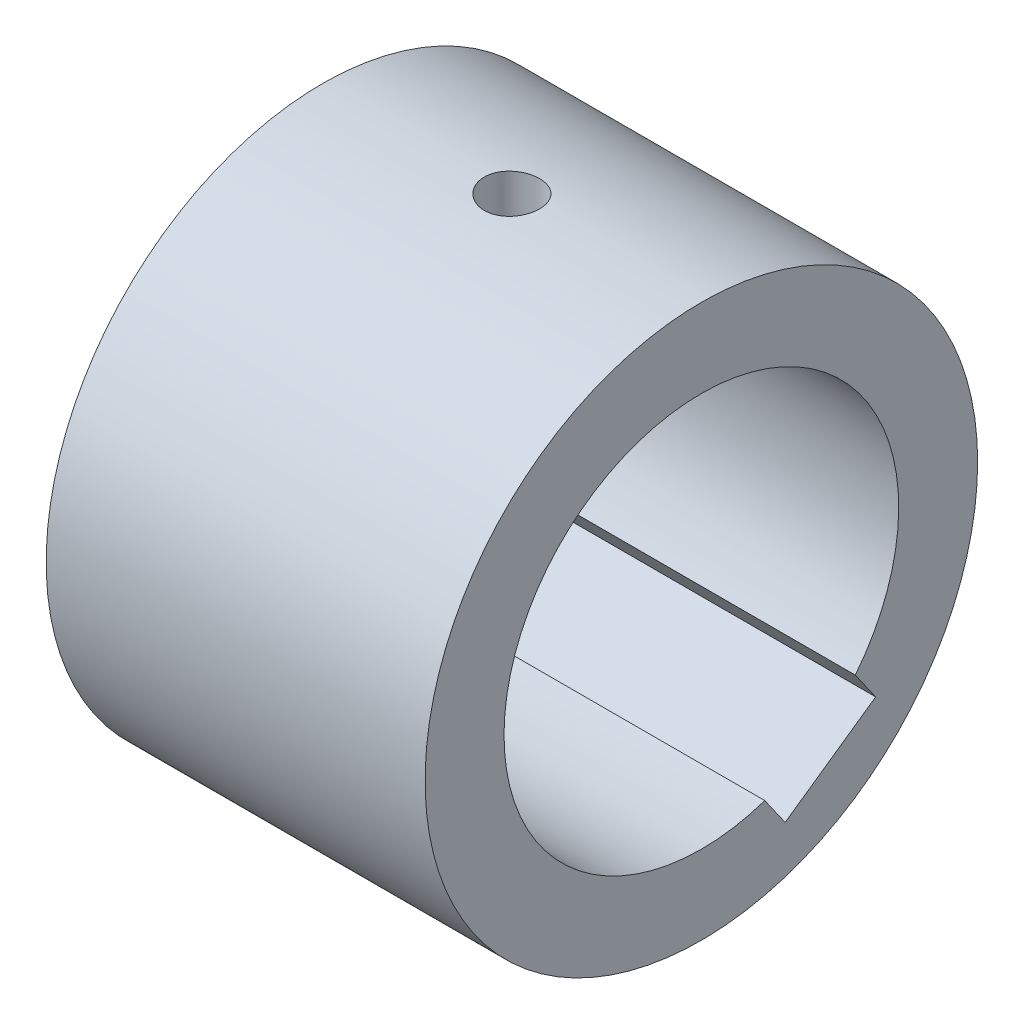
ISO-10303-21;
HEADER;
FILE_DESCRIPTION(('STEP AP214'),'2;1');
FILE_NAME('part.step','',(''),(''),'','','');
FILE_SCHEMA(('AUTOMOTIVE_DESIGN { 1 0 10303 214 1 1 1 1 }'));
ENDSEC;
DATA;
#1=APPLICATION_CONTEXT('core data for automotive mechanical design processes');
#2=APPLICATION_PROTOCOL_DEFINITION('international standard','automotive_design',2000,#1);
#3=PRODUCT_CONTEXT('',#1,'mechanical');
#4=PRODUCT('Part','Part','',(#3));
#5=PRODUCT_RELATED_PRODUCT_CATEGORY('part','',(#4));
#6=PRODUCT_DEFINITION_FORMATION('','',#4);
#7=PRODUCT_DEFINITION_CONTEXT('part definition',#1,'design');
#8=PRODUCT_DEFINITION('design','',#6,#7);
#9=PRODUCT_DEFINITION_SHAPE('','',#8);
#10=(LENGTH_UNIT() NAMED_UNIT(*) SI_UNIT(.MILLI.,.METRE.));
#11=(NAMED_UNIT(*) PLANE_ANGLE_UNIT() SI_UNIT($,.RADIAN.));
#12=(NAMED_UNIT(*) SI_UNIT($,.STERADIAN.) SOLID_ANGLE_UNIT());
#13=UNCERTAINTY_MEASURE_WITH_UNIT(LENGTH_MEASURE(1.E-05),#10,'distance_accuracy_value','');
#14=(GEOMETRIC_REPRESENTATION_CONTEXT(3) GLOBAL_UNCERTAINTY_ASSIGNED_CONTEXT((#13)) GLOBAL_UNIT_ASSIGNED_CONTEXT((#10,
#11,#12)) REPRESENTATION_CONTEXT('',''));
#15=CARTESIAN_POINT('',(0.,0.,0.));
#16=DIRECTION('',(0.,0.,1.));
#17=DIRECTION('',(1.,0.,0.));
#18=AXIS2_PLACEMENT_3D('',#15,#16,#17);
#19=CARTESIAN_POINT('',(24.,0.,0.));
#20=DIRECTION('',(1.,0.,0.));
#21=DIRECTION('',(0.,0.,-1.));
#22=AXIS2_PLACEMENT_3D('',#19,#20,#21);
#23=PLANE('',#22);
#24=DIRECTION('',(0.,0.819152044288985,0.573576436351056));
#25=VECTOR('',#24,1.);
#26=CARTESIAN_POINT('',(24.,-7.91344621185209,-14.0864768120863));
#27=LINE('',#26,#25);
#28=CARTESIAN_POINT('',(24.,-19.3307982077787,-22.080992746028));
#29=VERTEX_POINT('',#28);
#30=CARTESIAN_POINT('',(24.,-15.6446140084783,-19.4998987824482));
#31=VERTEX_POINT('',#30);
#32=EDGE_CURVE('E118',#29,#31,#27,.T.);
#33=ORIENTED_EDGE('',*,*,#32,.F.);
#34=DIRECTION('',(0.,0.573576436351056,-0.819152044288985));
#35=VECTOR('',#34,1.);
#36=CARTESIAN_POINT('',(24.,-19.3307982077787,-22.080992746028));
#37=LINE('',#36,#35);
#38=CARTESIAN_POINT('',(24.,-27.3608683166935,-10.6128641259822));
#39=VERTEX_POINT('',#38);
#40=EDGE_CURVE('E114',#39,#29,#37,.T.);
#41=ORIENTED_EDGE('',*,*,#40,.F.);
#42=DIRECTION('',(0.,-0.819152044288985,-0.573576436351056));
#43=VECTOR('',#42,1.);
#44=CARTESIAN_POINT('',(24.,-27.3608683166935,-10.6128641259822));
#45=LINE('',#44,#43);
#46=CARTESIAN_POINT('',(24.,-23.674684117393,-8.03177016240245));
#47=VERTEX_POINT('',#46);
#48=EDGE_CURVE('E97',#47,#39,#45,.T.);
#49=ORIENTED_EDGE('',*,*,#48,.F.);
#50=CARTESIAN_POINT('',(24.,0.,0.));
#51=DIRECTION('',(1.,0.,0.));
#52=DIRECTION('',(0.,0.,-1.));
#53=AXIS2_PLACEMENT_3D('',#50,#51,#52);
#54=CIRCLE('',#53,25.);
#55=EDGE_CURVE('E124',#31,#47,#54,.T.);
#56=ORIENTED_EDGE('',*,*,#55,.F.);
#57=EDGE_LOOP('',(#33,#41,#49,#56));
#58=FACE_BOUND('',#57,.T.);
#59=CARTESIAN_POINT('',(24.,0.,0.));
#60=DIRECTION('',(1.,0.,0.));
#61=DIRECTION('',(0.,0.,-1.));
#62=AXIS2_PLACEMENT_3D('',#59,#60,#61);
#63=CIRCLE('',#62,35.);
#64=CARTESIAN_POINT('',(24.,0.,-35.));
#65=VERTEX_POINT('',#64);
#66=EDGE_CURVE('E129',#65,#65,#63,.T.);
#67=ORIENTED_EDGE('',*,*,#66,.T.);
#68=EDGE_LOOP('',(#67));
#69=FACE_BOUND('',#68,.T.);
#70=ADVANCED_FACE('F48',(#58,#69),#23,.T.);
#71=CARTESIAN_POINT('',(-24.,0.,0.));
#72=DIRECTION('',(1.,0.,0.));
#73=DIRECTION('',(0.,0.,-1.));
#74=AXIS2_PLACEMENT_3D('',#71,#72,#73);
#75=PLANE('',#74);
#76=CARTESIAN_POINT('',(-24.,0.,0.));
#77=DIRECTION('',(1.,0.,0.));
#78=DIRECTION('',(0.,0.,-1.));
#79=AXIS2_PLACEMENT_3D('',#76,#77,#78);
#80=CIRCLE('',#79,35.);
#81=CARTESIAN_POINT('',(-24.,0.,-35.));
#82=VERTEX_POINT('',#81);
#83=EDGE_CURVE('E127',#82,#82,#80,.T.);
#84=ORIENTED_EDGE('',*,*,#83,.F.);
#85=EDGE_LOOP('',(#84));
#86=FACE_BOUND('',#85,.T.);
#87=DIRECTION('',(0.,0.573576436351056,-0.819152044288985));
#88=VECTOR('',#87,1.);
#89=CARTESIAN_POINT('',(-24.,-19.3307982077787,-22.080992746028));
#90=LINE('',#89,#88);
#91=CARTESIAN_POINT('',(-24.,-27.3608683166935,-10.6128641259822));
#92=VERTEX_POINT('',#91);
#93=CARTESIAN_POINT('',(-24.,-19.3307982077787,-22.080992746028));
#94=VERTEX_POINT('',#93);
#95=EDGE_CURVE('E102',#92,#94,#90,.T.);
#96=ORIENTED_EDGE('',*,*,#95,.T.);
#97=DIRECTION('',(0.,0.819152044288985,0.573576436351056));
#98=VECTOR('',#97,1.);
#99=CARTESIAN_POINT('',(-24.,-7.91344621185209,-14.0864768120863));
#100=LINE('',#99,#98);
#101=CARTESIAN_POINT('',(-24.,-15.6446140084783,-19.4998987824482));
#102=VERTEX_POINT('',#101);
#103=EDGE_CURVE('E112',#94,#102,#100,.T.);
#104=ORIENTED_EDGE('',*,*,#103,.T.);
#105=CARTESIAN_POINT('',(-24.,0.,0.));
#106=DIRECTION('',(1.,0.,0.));
#107=DIRECTION('',(0.,0.,-1.));
#108=AXIS2_PLACEMENT_3D('',#105,#106,#107);
#109=CIRCLE('',#108,25.);
#110=CARTESIAN_POINT('',(-24.,-23.674684117393,-8.03177016240245));
#111=VERTEX_POINT('',#110);
#112=EDGE_CURVE('E111',#102,#111,#109,.T.);
#113=ORIENTED_EDGE('',*,*,#112,.T.);
#114=DIRECTION('',(0.,-0.819152044288985,-0.573576436351056));
#115=VECTOR('',#114,1.);
#116=CARTESIAN_POINT('',(-24.,-27.3608683166935,-10.6128641259822));
#117=LINE('',#116,#115);
#118=EDGE_CURVE('E70',#111,#92,#117,.T.);
#119=ORIENTED_EDGE('',*,*,#118,.T.);
#120=EDGE_LOOP('',(#96,#104,#113,#119));
#121=FACE_BOUND('',#120,.T.);
#122=ADVANCED_FACE('F109',(#86,#121),#75,.F.);
#123=CARTESIAN_POINT('',(24.,0.,0.));
#124=DIRECTION('',(-1.,0.,0.));
#125=DIRECTION('',(0.,0.,1.));
#126=AXIS2_PLACEMENT_3D('',#123,#124,#125);
#127=CYLINDRICAL_SURFACE('',#126,35.);
#128=CARTESIAN_POINT('',(0.,34.8245602987317,3.49999999999988));
#129=CARTESIAN_POINT('',(-0.196068474615196,34.8245625976248,3.4999915068767));
#130=CARTESIAN_POINT('',(-0.392266589464245,34.8262339934706,3.48346900643453));
#131=CARTESIAN_POINT('',(-0.779223152048499,34.8327380631546,3.41780710166835));
#132=CARTESIAN_POINT('',(-0.969975363135411,34.8375742207731,3.36863175210201));
#133=CARTESIAN_POINT('',(-1.34038036725521,34.8498546570279,3.23911040624265));
#134=CARTESIAN_POINT('',(-1.52003981286804,34.8572973542366,3.15878330702893));
#135=CARTESIAN_POINT('',(-1.86328727302312,34.8739503199148,2.96927493586832));
#136=CARTESIAN_POINT('',(-2.02687847069355,34.883160237225,2.86009939469051));
#137=CARTESIAN_POINT('',(-2.33397942280071,34.9023474348731,2.61556666699545));
#138=CARTESIAN_POINT('',(-2.4774225332631,34.9123271001915,2.48012596337881));
#139=CARTESIAN_POINT('',(-2.73958163151263,34.931907683243,2.18708600361832));
#140=CARTESIAN_POINT('',(-2.85829648792213,34.9415085836306,2.02948573417286));
#141=CARTESIAN_POINT('',(-3.06785939952499,34.9592734104481,1.69619226577834));
#142=CARTESIAN_POINT('',(-3.15864849577781,34.9674342813132,1.52046181885337));
#143=CARTESIAN_POINT('',(-3.3094055160204,34.9813735906515,1.15615494500616));
#144=CARTESIAN_POINT('',(-3.36937419129314,34.9871520871971,0.967578831338643));
#145=CARTESIAN_POINT('',(-3.45659268273637,34.995658829986,0.583606739600202));
#146=CARTESIAN_POINT('',(-3.48395191462481,34.9983972744986,0.388235844610414));
#147=CARTESIAN_POINT('',(-3.50551344196801,35.0005500459542,-0.00434259241142233));
#148=CARTESIAN_POINT('',(-3.49971659711196,34.9999644590845,-0.201550086690736));
#149=CARTESIAN_POINT('',(-3.45521934572445,34.9955434958915,-0.591460954226082));
#150=CARTESIAN_POINT('',(-3.41663659552638,34.99171974031,-0.784177904772548));
#151=CARTESIAN_POINT('',(-3.30784604868683,34.9812655242726,-1.16038712826599));
#152=CARTESIAN_POINT('',(-3.2376378412435,34.9746350273584,-1.34387928135217));
#153=CARTESIAN_POINT('',(-3.06746032860946,34.959292811937,-1.69680110137867));
#154=CARTESIAN_POINT('',(-2.96743895864445,34.9505774578015,-1.8662054984359));
#155=CARTESIAN_POINT('',(-2.74051216832271,34.9320434581793,-2.1858672961098));
#156=CARTESIAN_POINT('',(-2.61360595949186,34.9222247803384,-2.33612413496302));
#157=CARTESIAN_POINT('',(-2.33585019670224,34.9025352713748,-2.61391470137953));
#158=CARTESIAN_POINT('',(-2.18489829340448,34.892664400056,-2.74134611166633));
#159=CARTESIAN_POINT('',(-1.86369097176228,34.8740258974878,-2.96907637375283));
#160=CARTESIAN_POINT('',(-1.6934355254175,34.8652582678387,-3.06937518619524));
#161=CARTESIAN_POINT('',(-1.33837541180073,34.8498181329952,-3.23999264600643));
#162=CARTESIAN_POINT('',(-1.15356768651989,34.8431460696394,-3.31030497200548));
#163=CARTESIAN_POINT('',(-0.77468788384859,34.8326615654828,-3.41887257473168));
#164=CARTESIAN_POINT('',(-0.580616088893944,34.8288490375619,-3.45712882810074));
#165=CARTESIAN_POINT('',(-0.189615371646723,34.8245303184596,-3.50036671387198));
#166=CARTESIAN_POINT('',(0.00729757092691552,34.8240099041661,-3.50549148826536));
#167=CARTESIAN_POINT('',(0.39917943038002,34.826296797417,-3.48269686404989));
#168=CARTESIAN_POINT('',(0.594148373491285,34.8291040599971,-3.45477791193426));
#169=CARTESIAN_POINT('',(0.976190537974195,34.8377170547841,-3.36680811077644));
#170=CARTESIAN_POINT('',(1.16327949883131,34.8435164700471,-3.3068249451613));
#171=CARTESIAN_POINT('',(1.52474018105607,34.8574551863578,-3.15649851886591));
#172=CARTESIAN_POINT('',(1.69911161100514,34.8655945410034,-3.06615456274268));
#173=CARTESIAN_POINT('',(2.03083990910072,34.88333045245,-2.85731250498138));
#174=CARTESIAN_POINT('',(2.18813679688189,34.8929318785135,-2.73871954944254));
#175=CARTESIAN_POINT('',(2.48064268645923,34.9124941418815,-2.47688186707923));
#176=CARTESIAN_POINT('',(2.61585114119027,34.9224549880803,-2.33363652986859));
#177=CARTESIAN_POINT('',(2.86083571689332,34.9416566747256,-2.02593931479278));
#178=CARTESIAN_POINT('',(2.97051845855177,34.9508947919416,-1.8614128958932));
#179=CARTESIAN_POINT('',(3.16069553977244,34.9675704737321,-1.51619201096008));
#180=CARTESIAN_POINT('',(3.24119027927486,34.9750080629773,-1.33549776650381));
#181=CARTESIAN_POINT('',(3.37054818679367,34.9872323644902,-0.963396442514975));
#182=CARTESIAN_POINT('',(3.41946775563825,34.9920238011977,-0.77200913177498));
#183=CARTESIAN_POINT('',(3.48447074352945,34.9984353114778,-0.383686848942998));
#184=CARTESIAN_POINT('',(3.50055508541913,35.0000554741798,-0.186752032922882));
#185=CARTESIAN_POINT('',(3.4994180674602,34.9999418409643,0.206157784264988));
#186=CARTESIAN_POINT('',(3.48234167107171,34.998222643183,0.402133225285718));
#187=CARTESIAN_POINT('',(3.41567189020057,34.9916522752161,0.788416609247154));
#188=CARTESIAN_POINT('',(3.36607848019455,34.9868011025722,0.978724547739183));
#189=CARTESIAN_POINT('',(3.23582259912479,34.974510333487,1.34826968068696));
#190=CARTESIAN_POINT('',(3.15516436573066,34.9670710901076,1.52750838127113));
#191=CARTESIAN_POINT('',(2.96508390879036,34.9504334345765,1.86992610054176));
#192=CARTESIAN_POINT('',(2.8556618535503,34.9412350327182,2.03310521319019));
#193=CARTESIAN_POINT('',(2.61061633341766,34.9220614633941,2.33951453549381));
#194=CARTESIAN_POINT('',(2.47488494314616,34.9120832010391,2.48265824176625));
#195=CARTESIAN_POINT('',(2.18128626958798,34.8925006770235,2.74420215787719));
#196=CARTESIAN_POINT('',(2.0234136818972,34.882896505691,2.86259642147227));
#197=CARTESIAN_POINT('',(1.68957480328959,34.8651234190513,3.07151824148024));
#198=CARTESIAN_POINT('',(1.51356351540338,34.8569582161914,3.16197415796529));
#199=CARTESIAN_POINT('',(1.14888098067601,34.8430318155411,3.31192647832916));
#200=CARTESIAN_POINT('',(0.960224286269832,34.8372679076444,3.37145780261068));
#201=CARTESIAN_POINT('',(0.642082906848253,34.8302502639813,3.44302590916929));
#202=CARTESIAN_POINT('',(0.514632120425643,34.828126617742,3.4643619933941));
#203=CARTESIAN_POINT('',(0.258139619352917,34.8252808812256,3.49285180511734));
#204=CARTESIAN_POINT('',(0.129097911383504,34.8245587850651,3.50000559215061));
#205=CARTESIAN_POINT('',(0.,34.8245602987317,3.49999999999988));
#206=B_SPLINE_CURVE_WITH_KNOTS('',3,(#128,#129,#130,#131,#132,#133,#134,#135,#136,#137,#138,
#139,#140,#141,#142,#143,#144,#145,#146,#147,#148,#149,#150,#151,#152,#153,#154,#155,#156,#157,
#158,#159,#160,#161,#162,#163,#164,#165,#166,#167,#168,#169,#170,#171,#172,#173,#174,#175,#176,
#177,#178,#179,#180,#181,#182,#183,#184,#185,#186,#187,#188,#189,#190,#191,#192,#193,#194,#195,
#196,#197,#198,#199,#200,#201,#202,#203,#204,#205),.UNSPECIFIED.,.T.,.F.,(4,2,2,2,2,2,2,2,2,2,2,
2,2,2,2,2,2,2,2,2,2,2,2,2,2,2,2,2,2,2,2,2,2,2,2,2,2,2,4),(0.,0.58773398053861,1.17611603139755,
1.76414171851251,2.35205068149596,2.94186065356873,3.53169760495521,4.12277144901656,
4.71383088429417,5.30290148146709,5.89195680495949,6.47890711367451,7.06586504685546,
7.65385409134583,8.24186038266986,8.8324398779964,9.42302022998605,10.013725019149,
10.6044118108475,11.1925448707931,11.7806699838618,12.3675585146798,12.954460489658,
13.5433616434315,14.1322773803334,14.7233147886555,15.3143440981515,15.904314744324,
16.4942688089816,17.0816496714183,17.6690309949044,18.256332219855,18.8436300083993,
19.4333900263509,20.0232915762297,20.6146934374943,21.2054260213252,21.5924109662468,
21.9793942866687),.UNSPECIFIED.);
#207=CARTESIAN_POINT('',(0.,34.8245602987317,3.49999999999988));
#208=VERTEX_POINT('',#207);
#209=EDGE_CURVE('E120',#208,#208,#206,.T.);
#210=ORIENTED_EDGE('',*,*,#209,.T.);
#211=EDGE_LOOP('',(#210));
#212=FACE_BOUND('',#211,.T.);
#213=ORIENTED_EDGE('',*,*,#66,.F.);
#214=EDGE_LOOP('',(#213));
#215=FACE_BOUND('',#214,.T.);
#216=ORIENTED_EDGE('',*,*,#83,.T.);
#217=EDGE_LOOP('',(#216));
#218=FACE_BOUND('',#217,.T.);
#219=ADVANCED_FACE('F50',(#212,#215,#218),#127,.T.);
#220=CARTESIAN_POINT('',(24.,0.,0.));
#221=DIRECTION('',(-1.,0.,0.));
#222=DIRECTION('',(0.,0.,1.));
#223=AXIS2_PLACEMENT_3D('',#220,#221,#222);
#224=CYLINDRICAL_SURFACE('',#223,25.);
#225=CARTESIAN_POINT('',(0.,24.7537875889731,3.49999999999991));
#226=CARTESIAN_POINT('',(-0.195560154767575,24.7537906822583,3.49999181655899));
#227=CARTESIAN_POINT('',(-0.391237507482555,24.7561300920155,3.48355443558917));
#228=CARTESIAN_POINT('',(-0.777131922734741,24.76522981384,3.41825061741048));
#229=CARTESIAN_POINT('',(-0.967343298780199,24.7719945675026,3.36935159862291));
#230=CARTESIAN_POINT('',(-1.33666359330411,24.7891640928697,3.2406069700329));
#231=CARTESIAN_POINT('',(-1.51578050601989,24.7995662068558,3.16078395095821));
#232=CARTESIAN_POINT('',(-1.85804877360261,24.8228352266466,2.97250847563916));
#233=CARTESIAN_POINT('',(-2.02120254431549,24.8357017586143,2.86406036070275));
#234=CARTESIAN_POINT('',(-2.32808215853283,24.8625504844522,2.62080281251517));
#235=CARTESIAN_POINT('',(-2.47168026194528,24.8765391460462,2.48583292443012));
#236=CARTESIAN_POINT('',(-2.73426680506273,24.9039980636581,2.1937092685364));
#237=CARTESIAN_POINT('',(-2.85325394710894,24.9174682923102,2.03655433171439));
#238=CARTESIAN_POINT('',(-3.06370718457442,24.9424397352459,1.7037092427827));
#239=CARTESIAN_POINT('',(-3.15505643492662,24.9539325035401,1.5279445235744));
#240=CARTESIAN_POINT('',(-3.30689160701615,24.9735826810557,1.16337996516009));
#241=CARTESIAN_POINT('',(-3.36737895417656,24.9817402443171,0.974580728438527));
#242=CARTESIAN_POINT('',(-3.45538823852594,24.9937552741093,0.590618783329255));
#243=CARTESIAN_POINT('',(-3.48312354003459,24.9976405609784,0.39550586551262));
#244=CARTESIAN_POINT('',(-3.50550340939038,25.0007684801016,0.00335922712109844));
#245=CARTESIAN_POINT('',(-3.50014959052891,25.0000113387018,-0.193674399340166));
#246=CARTESIAN_POINT('',(-3.45667267130987,24.9939620558024,-0.582615400058849));
#247=CARTESIAN_POINT('',(-3.41877908235907,24.9887016775951,-0.77454899363336));
#248=CARTESIAN_POINT('',(-3.31165791632868,24.9742724352295,-1.1493059403018));
#249=CARTESIAN_POINT('',(-3.2424296191148,24.9651034812448,-1.33212908391216));
#250=CARTESIAN_POINT('',(-3.07436539311271,24.9438325860369,-1.68417680329696));
#251=CARTESIAN_POINT('',(-2.97543170896317,24.9317209865754,-1.85335410431128));
#252=CARTESIAN_POINT('',(-2.75083632806707,24.9059168552186,-2.17279223786532));
#253=CARTESIAN_POINT('',(-2.6251730960448,24.8922242325342,-2.32305198304032));
#254=CARTESIAN_POINT('',(-2.34940423165519,24.8646488503525,-2.60174071972411));
#255=CARTESIAN_POINT('',(-2.19909835937842,24.8507654670317,-2.72997158820316));
#256=CARTESIAN_POINT('',(-1.87899432350826,24.8244883316295,-2.95941854341821));
#257=CARTESIAN_POINT('',(-1.70919606731678,24.8120945866252,-3.06063450181293));
#258=CARTESIAN_POINT('',(-1.35473337110271,24.7902003566841,-3.23319870278271));
#259=CARTESIAN_POINT('',(-1.17005982427998,24.7807016614096,-3.30452848048132));
#260=CARTESIAN_POINT('',(-0.791192209672886,24.7657059743542,-3.41510621643369));
#261=CARTESIAN_POINT('',(-0.596998723344254,24.7602087384978,-3.45435613146944));
#262=CARTESIAN_POINT('',(-0.206360947689206,24.7538840422246,-3.49939221005379));
#263=CARTESIAN_POINT('',(-0.00994954822496354,24.7530175108533,-3.50545836748379));
#264=CARTESIAN_POINT('',(0.381086893072054,24.755948778245,-3.48469592776285));
#265=CARTESIAN_POINT('',(0.575711982828229,24.7597464515054,-3.45786821570808));
#266=CARTESIAN_POINT('',(0.956795666068332,24.7715424400724,-3.37231633400967));
#267=CARTESIAN_POINT('',(1.14328581530875,24.7795225973313,-3.3137300054231));
#268=CARTESIAN_POINT('',(1.50379762778359,24.7987695354145,-3.16646669264694));
#269=CARTESIAN_POINT('',(1.67781874866506,24.8100364590921,-3.07778840053819));
#270=CARTESIAN_POINT('',(2.00971273491393,24.8346801452907,-2.87217909544431));
#271=CARTESIAN_POINT('',(2.16747168569053,24.8480703159863,-2.75506583601389));
#272=CARTESIAN_POINT('',(2.4611957887449,24.875410682501,-2.49616615385776));
#273=CARTESIAN_POINT('',(2.59715987130254,24.8893609057662,-2.35437852079399));
#274=CARTESIAN_POINT('',(2.84443100323985,24.9163707911093,-2.04892599936437));
#275=CARTESIAN_POINT('',(2.95555315271703,24.9294233048069,-1.8851107059176));
#276=CARTESIAN_POINT('',(3.14870159069414,24.9530578482668,-1.54097657080121));
#277=CARTESIAN_POINT('',(3.2307285895544,24.9636399383426,-1.36065813219238));
#278=CARTESIAN_POINT('',(3.36305865647722,24.9811098395859,-0.989229139282875));
#279=CARTESIAN_POINT('',(3.4134652371279,24.9880096937281,-0.798156053861498));
#280=CARTESIAN_POINT('',(3.4814593912701,24.9973880303632,-0.410154489530087));
#281=CARTESIAN_POINT('',(3.49904884140295,24.9998667656766,-0.21322634609474));
#282=CARTESIAN_POINT('',(3.5008681558451,25.000121613377,0.179096941501349));
#283=CARTESIAN_POINT('',(3.48538184019311,24.9979377352712,0.374490803444288));
#284=CARTESIAN_POINT('',(3.42209452891469,24.9891929064383,0.759868138965443));
#285=CARTESIAN_POINT('',(3.37429359967922,24.9826319647038,0.949851623658541));
#286=CARTESIAN_POINT('',(3.24782988921627,24.9658667061347,1.31895434116059));
#287=CARTESIAN_POINT('',(3.16918424064728,24.9556644121669,1.49807954152811));
#288=CARTESIAN_POINT('',(2.98329332105218,24.9327408556312,1.84063575824949));
#289=CARTESIAN_POINT('',(2.87604736542495,24.9200195327676,2.00406639879774));
#290=CARTESIAN_POINT('',(2.63496342765128,24.8933445340092,2.31203862615948));
#291=CARTESIAN_POINT('',(2.50091509911646,24.8793816286934,2.45641476524119));
#292=CARTESIAN_POINT('',(2.21047306678788,24.8518678878302,2.72072938480244));
#293=CARTESIAN_POINT('',(2.05407411017749,24.8383171500605,2.84066210449918));
#294=CARTESIAN_POINT('',(1.72248429059404,24.8130916210476,3.05319975931045));
#295=CARTESIAN_POINT('',(1.54720581657095,24.801426264232,3.14566908745307));
#296=CARTESIAN_POINT('',(1.18353239989126,24.7814027288131,3.29972220584228));
#297=CARTESIAN_POINT('',(0.995151587980839,24.7730410503233,3.36133869990577));
#298=CARTESIAN_POINT('',(0.671556886996481,24.7625452599898,3.43762752385736));
#299=CARTESIAN_POINT('',(0.538360644804012,24.759278094514,3.46098233554839));
#300=CARTESIAN_POINT('',(0.270128231058788,24.7548982019194,3.49217131855808));
#301=CARTESIAN_POINT('',(0.13509207886887,24.7537854521456,3.50000565308425));
#302=CARTESIAN_POINT('',(0.,24.7537875889731,3.49999999999991));
#303=B_SPLINE_CURVE_WITH_KNOTS('',3,(#225,#226,#227,#228,#229,#230,#231,#232,#233,#234,#235,
#236,#237,#238,#239,#240,#241,#242,#243,#244,#245,#246,#247,#248,#249,#250,#251,#252,#253,#254,
#255,#256,#257,#258,#259,#260,#261,#262,#263,#264,#265,#266,#267,#268,#269,#270,#271,#272,#273,
#274,#275,#276,#277,#278,#279,#280,#281,#282,#283,#284,#285,#286,#287,#288,#289,#290,#291,#292,
#293,#294,#295,#296,#297,#298,#299,#300,#301,#302),.UNSPECIFIED.,.T.,.F.,(4,2,2,2,2,2,2,2,2,2,2,
2,2,2,2,2,2,2,2,2,2,2,2,2,2,2,2,2,2,2,2,2,2,2,2,2,2,2,4),(0.,0.586186802715839,1.17296284945572,
1.75931104800062,2.34557037149055,2.93549224141235,3.52544520813938,4.11785855282521,
4.71024453315484,5.29874972351533,5.88722622097413,6.47158581791365,7.05595884528782,
7.64227642364724,8.22862768766166,8.82000392576343,9.41138297329996,10.0031268615642,
10.5948346524106,11.1815420123042,11.7682335856381,12.3523989110571,12.9365896299306,
13.5246282706496,14.1126957642295,14.7050044334248,15.2972986403631,15.887643653788,
16.4779549074112,17.0632211173544,17.6484861248614,18.233426507049,18.8183808921209,
19.4081201968966,19.997998330098,20.5907424672804,21.1828569621121,21.58779643772,
21.9927316551138),.UNSPECIFIED.);
#304=CARTESIAN_POINT('',(0.,24.7537875889731,3.49999999999991));
#305=VERTEX_POINT('',#304);
#306=EDGE_CURVE('E53',#305,#305,#303,.T.);
#307=ORIENTED_EDGE('',*,*,#306,.F.);
#308=EDGE_LOOP('',(#307));
#309=FACE_BOUND('',#308,.T.);
#310=DIRECTION('',(-1.,0.,0.));
#311=VECTOR('',#310,1.);
#312=CARTESIAN_POINT('',(24.,-15.6446140084782,-19.4998987824482));
#313=LINE('',#312,#311);
#314=EDGE_CURVE('E13',#31,#102,#313,.T.);
#315=ORIENTED_EDGE('',*,*,#314,.F.);
#316=ORIENTED_EDGE('',*,*,#55,.T.);
#317=DIRECTION('',(-1.,0.,0.));
#318=VECTOR('',#317,1.);
#319=CARTESIAN_POINT('',(24.,-23.674684117393,-8.03177016240245));
#320=LINE('',#319,#318);
#321=EDGE_CURVE('E63',#111,#47,#320,.F.);
#322=ORIENTED_EDGE('',*,*,#321,.F.);
#323=ORIENTED_EDGE('',*,*,#112,.F.);
#324=EDGE_LOOP('',(#315,#316,#322,#323));
#325=FACE_BOUND('',#324,.T.);
#326=ADVANCED_FACE('F139',(#309,#325),#224,.F.);
#327=CARTESIAN_POINT('',(-24.,-7.91344621185209,-14.0864768120863));
#328=DIRECTION('',(0.,0.573576436351056,-0.819152044288985));
#329=DIRECTION('',(0.,0.819152044288985,0.573576436351056));
#330=AXIS2_PLACEMENT_3D('',#327,#328,#329);
#331=PLANE('',#330);
#332=ORIENTED_EDGE('',*,*,#314,.T.);
#333=ORIENTED_EDGE('',*,*,#103,.F.);
#334=DIRECTION('',(1.,0.,0.));
#335=VECTOR('',#334,1.);
#336=CARTESIAN_POINT('',(-24.,-19.3307982077787,-22.080992746028));
#337=LINE('',#336,#335);
#338=EDGE_CURVE('E101',#94,#29,#337,.T.);
#339=ORIENTED_EDGE('',*,*,#338,.T.);
#340=ORIENTED_EDGE('',*,*,#32,.T.);
#341=EDGE_LOOP('',(#332,#333,#339,#340));
#342=FACE_BOUND('',#341,.T.);
#343=ADVANCED_FACE('F141',(#342),#331,.F.);
#344=CARTESIAN_POINT('',(-24.,-19.3307982077787,-22.080992746028));
#345=DIRECTION('',(0.,-0.819152044288985,-0.573576436351056));
#346=DIRECTION('',(0.,0.573576436351056,-0.819152044288985));
#347=AXIS2_PLACEMENT_3D('',#344,#345,#346);
#348=PLANE('',#347);
#349=ORIENTED_EDGE('',*,*,#40,.T.);
#350=ORIENTED_EDGE('',*,*,#338,.F.);
#351=ORIENTED_EDGE('',*,*,#95,.F.);
#352=DIRECTION('',(1.,0.,0.));
#353=VECTOR('',#352,1.);
#354=CARTESIAN_POINT('',(-24.,-27.3608683166935,-10.6128641259822));
#355=LINE('',#354,#353);
#356=EDGE_CURVE('E93',#92,#39,#355,.T.);
#357=ORIENTED_EDGE('',*,*,#356,.T.);
#358=EDGE_LOOP('',(#349,#350,#351,#357));
#359=FACE_BOUND('',#358,.T.);
#360=ADVANCED_FACE('F105',(#359),#348,.F.);
#361=CARTESIAN_POINT('',(-24.,-27.3608683166935,-10.6128641259822));
#362=DIRECTION('',(0.,-0.573576436351056,0.819152044288985));
#363=DIRECTION('',(0.,-0.819152044288985,-0.573576436351056));
#364=AXIS2_PLACEMENT_3D('',#361,#362,#363);
#365=PLANE('',#364);
#366=ORIENTED_EDGE('',*,*,#321,.T.);
#367=ORIENTED_EDGE('',*,*,#48,.T.);
#368=ORIENTED_EDGE('',*,*,#356,.F.);
#369=ORIENTED_EDGE('',*,*,#118,.F.);
#370=EDGE_LOOP('',(#366,#367,#368,#369));
#371=FACE_BOUND('',#370,.T.);
#372=ADVANCED_FACE('F95',(#371),#365,.F.);
#373=CARTESIAN_POINT('',(0.,11.,0.));
#374=DIRECTION('',(0.,1.,0.));
#375=DIRECTION('',(0.,0.,1.));
#376=AXIS2_PLACEMENT_3D('',#373,#374,#375);
#377=CYLINDRICAL_SURFACE('',#376,3.5);
#378=ORIENTED_EDGE('',*,*,#306,.T.);
#379=EDGE_LOOP('',(#378));
#380=FACE_BOUND('',#379,.T.);
#381=ORIENTED_EDGE('',*,*,#209,.F.);
#382=EDGE_LOOP('',(#381));
#383=FACE_BOUND('',#382,.T.);
#384=ADVANCED_FACE('F181',(#380,#383),#377,.F.);
#385=CLOSED_SHELL('',(#70,#122,#219,#326,#343,#360,#372,#384));
#386=MANIFOLD_SOLID_BREP('B2',#385);
#387=ADVANCED_BREP_SHAPE_REPRESENTATION('',(#18,#386),#14);
#388=SHAPE_DEFINITION_REPRESENTATION(#9,#387);
ENDSEC;
END-ISO-10303-21;
